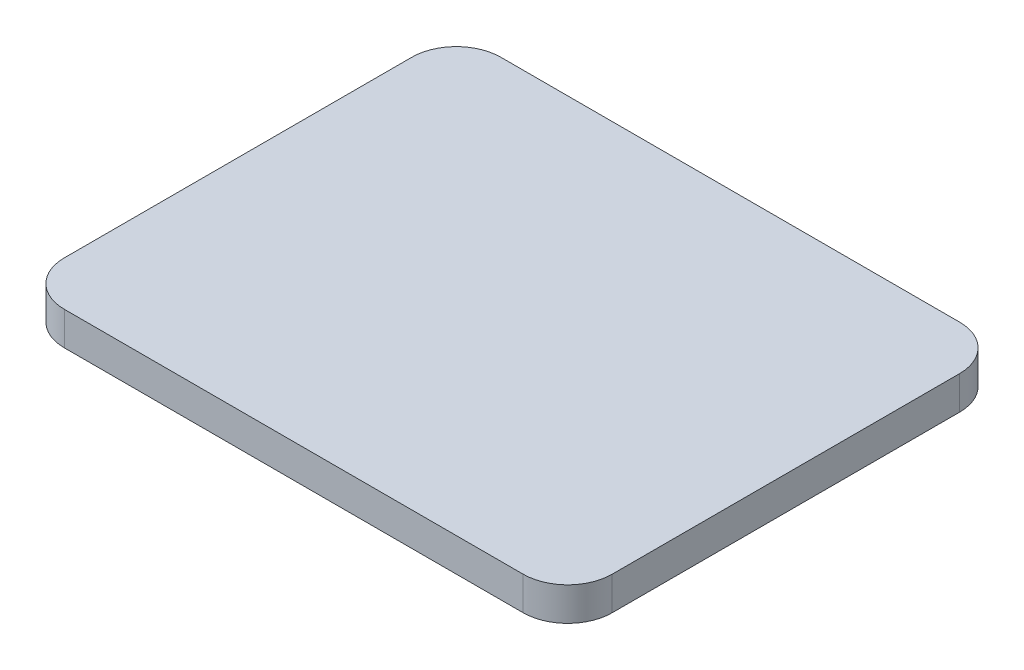
ISO-10303-21;
HEADER;
FILE_DESCRIPTION(('STEP AP214'),'2;1');
FILE_NAME('part.step','',(''),(''),'','','');
FILE_SCHEMA(('AUTOMOTIVE_DESIGN { 1 0 10303 214 1 1 1 1 }'));
ENDSEC;
DATA;
#1=APPLICATION_CONTEXT('core data for automotive mechanical design processes');
#2=APPLICATION_PROTOCOL_DEFINITION('international standard','automotive_design',2000,#1);
#3=PRODUCT_CONTEXT('',#1,'mechanical');
#4=PRODUCT('Part','Part','',(#3));
#5=PRODUCT_RELATED_PRODUCT_CATEGORY('part','',(#4));
#6=PRODUCT_DEFINITION_FORMATION('','',#4);
#7=PRODUCT_DEFINITION_CONTEXT('part definition',#1,'design');
#8=PRODUCT_DEFINITION('design','',#6,#7);
#9=PRODUCT_DEFINITION_SHAPE('','',#8);
#10=(LENGTH_UNIT() NAMED_UNIT(*) SI_UNIT(.MILLI.,.METRE.));
#11=(NAMED_UNIT(*) PLANE_ANGLE_UNIT() SI_UNIT($,.RADIAN.));
#12=(NAMED_UNIT(*) SI_UNIT($,.STERADIAN.) SOLID_ANGLE_UNIT());
#13=UNCERTAINTY_MEASURE_WITH_UNIT(LENGTH_MEASURE(1.E-05),#10,'distance_accuracy_value','');
#14=(GEOMETRIC_REPRESENTATION_CONTEXT(3) GLOBAL_UNCERTAINTY_ASSIGNED_CONTEXT((#13)) GLOBAL_UNIT_ASSIGNED_CONTEXT((#10,
#11,#12)) REPRESENTATION_CONTEXT('',''));
#15=CARTESIAN_POINT('',(0.,0.,0.));
#16=DIRECTION('',(0.,0.,1.));
#17=DIRECTION('',(1.,0.,0.));
#18=AXIS2_PLACEMENT_3D('',#15,#16,#17);
#19=CARTESIAN_POINT('',(0.,0.,0.));
#20=DIRECTION('',(0.,-1.,0.));
#21=DIRECTION('',(0.,0.,-1.));
#22=AXIS2_PLACEMENT_3D('',#19,#20,#21);
#23=PLANE('',#22);
#24=DIRECTION('',(1.,0.,0.));
#25=VECTOR('',#24,1.);
#26=CARTESIAN_POINT('',(0.,0.,0.));
#27=LINE('',#26,#25);
#28=CARTESIAN_POINT('',(5.08,0.,0.));
#29=VERTEX_POINT('',#28);
#30=CARTESIAN_POINT('',(57.404,0.,0.));
#31=VERTEX_POINT('',#30);
#32=EDGE_CURVE('E197',#29,#31,#27,.T.);
#33=ORIENTED_EDGE('',*,*,#32,.T.);
#34=CARTESIAN_POINT('',(57.404,0.,5.08));
#35=DIRECTION('',(0.,-1.,0.));
#36=DIRECTION('',(0.,0.,-1.));
#37=AXIS2_PLACEMENT_3D('',#34,#35,#36);
#38=CIRCLE('',#37,5.08);
#39=CARTESIAN_POINT('',(62.484,0.,5.08));
#40=VERTEX_POINT('',#39);
#41=EDGE_CURVE('E230',#31,#40,#38,.T.);
#42=ORIENTED_EDGE('',*,*,#41,.T.);
#43=DIRECTION('',(0.,0.,1.));
#44=VECTOR('',#43,1.);
#45=CARTESIAN_POINT('',(62.484,0.,0.));
#46=LINE('',#45,#44);
#47=CARTESIAN_POINT('',(62.484,0.,44.704));
#48=VERTEX_POINT('',#47);
#49=EDGE_CURVE('E214',#40,#48,#46,.T.);
#50=ORIENTED_EDGE('',*,*,#49,.T.);
#51=CARTESIAN_POINT('',(57.404,0.,44.704));
#52=DIRECTION('',(0.,-1.,0.));
#53=DIRECTION('',(0.,0.,-1.));
#54=AXIS2_PLACEMENT_3D('',#51,#52,#53);
#55=CIRCLE('',#54,5.08);
#56=CARTESIAN_POINT('',(57.404,0.,49.784));
#57=VERTEX_POINT('',#56);
#58=EDGE_CURVE('E228',#48,#57,#55,.T.);
#59=ORIENTED_EDGE('',*,*,#58,.T.);
#60=DIRECTION('',(1.,0.,0.));
#61=VECTOR('',#60,1.);
#62=CARTESIAN_POINT('',(0.,0.,49.784));
#63=LINE('',#62,#61);
#64=CARTESIAN_POINT('',(5.08,0.,49.784));
#65=VERTEX_POINT('',#64);
#66=EDGE_CURVE('E365',#65,#57,#63,.T.);
#67=ORIENTED_EDGE('',*,*,#66,.F.);
#68=CARTESIAN_POINT('',(5.08,0.,44.704));
#69=DIRECTION('',(0.,-1.,0.));
#70=DIRECTION('',(0.,0.,-1.));
#71=AXIS2_PLACEMENT_3D('',#68,#69,#70);
#72=CIRCLE('',#71,5.08);
#73=CARTESIAN_POINT('',(0.,0.,44.704));
#74=VERTEX_POINT('',#73);
#75=EDGE_CURVE('E204',#65,#74,#72,.T.);
#76=ORIENTED_EDGE('',*,*,#75,.T.);
#77=DIRECTION('',(0.,0.,1.));
#78=VECTOR('',#77,1.);
#79=CARTESIAN_POINT('',(0.,0.,0.));
#80=LINE('',#79,#78);
#81=CARTESIAN_POINT('',(0.,0.,5.08));
#82=VERTEX_POINT('',#81);
#83=EDGE_CURVE('E199',#82,#74,#80,.T.);
#84=ORIENTED_EDGE('',*,*,#83,.F.);
#85=CARTESIAN_POINT('',(5.08,0.,5.08));
#86=DIRECTION('',(0.,-1.,0.));
#87=DIRECTION('',(0.,0.,-1.));
#88=AXIS2_PLACEMENT_3D('',#85,#86,#87);
#89=CIRCLE('',#88,5.08);
#90=EDGE_CURVE('E194',#82,#29,#89,.T.);
#91=ORIENTED_EDGE('',*,*,#90,.T.);
#92=EDGE_LOOP('',(#33,#42,#50,#59,#67,#76,#84,#91));
#93=FACE_BOUND('',#92,.T.);
#94=DIRECTION('',(-1.,0.,0.));
#95=VECTOR('',#94,1.);
#96=CARTESIAN_POINT('',(58.547,0.,45.847));
#97=LINE('',#96,#95);
#98=CARTESIAN_POINT('',(53.467,0.,45.847));
#99=VERTEX_POINT('',#98);
#100=CARTESIAN_POINT('',(9.01700000000002,0.,45.847));
#101=VERTEX_POINT('',#100);
#102=EDGE_CURVE('E369',#99,#101,#97,.T.);
#103=ORIENTED_EDGE('',*,*,#102,.F.);
#104=CARTESIAN_POINT('',(53.467,0.,40.767));
#105=DIRECTION('',(0.,-1.,0.));
#106=DIRECTION('',(0.,0.,-1.));
#107=AXIS2_PLACEMENT_3D('',#104,#105,#106);
#108=CIRCLE('',#107,5.08);
#109=CARTESIAN_POINT('',(58.547,0.,40.767));
#110=VERTEX_POINT('',#109);
#111=EDGE_CURVE('E287',#99,#110,#108,.F.);
#112=ORIENTED_EDGE('',*,*,#111,.T.);
#113=DIRECTION('',(0.,0.,1.));
#114=VECTOR('',#113,1.);
#115=CARTESIAN_POINT('',(58.547,0.,3.937));
#116=LINE('',#115,#114);
#117=CARTESIAN_POINT('',(58.547,0.,9.017));
#118=VERTEX_POINT('',#117);
#119=EDGE_CURVE('E366',#118,#110,#116,.T.);
#120=ORIENTED_EDGE('',*,*,#119,.F.);
#121=CARTESIAN_POINT('',(53.467,0.,9.017));
#122=DIRECTION('',(0.,-1.,0.));
#123=DIRECTION('',(0.,0.,-1.));
#124=AXIS2_PLACEMENT_3D('',#121,#122,#123);
#125=CIRCLE('',#124,5.08);
#126=CARTESIAN_POINT('',(53.467,0.,3.937));
#127=VERTEX_POINT('',#126);
#128=EDGE_CURVE('E285',#118,#127,#125,.F.);
#129=ORIENTED_EDGE('',*,*,#128,.T.);
#130=DIRECTION('',(1.,0.,0.));
#131=VECTOR('',#130,1.);
#132=CARTESIAN_POINT('',(3.937,0.,3.937));
#133=LINE('',#132,#131);
#134=CARTESIAN_POINT('',(9.017,0.,3.937));
#135=VERTEX_POINT('',#134);
#136=EDGE_CURVE('E356',#135,#127,#133,.T.);
#137=ORIENTED_EDGE('',*,*,#136,.F.);
#138=CARTESIAN_POINT('',(9.017,0.,9.017));
#139=DIRECTION('',(0.,-1.,0.));
#140=DIRECTION('',(0.,0.,-1.));
#141=AXIS2_PLACEMENT_3D('',#138,#139,#140);
#142=CIRCLE('',#141,5.08);
#143=CARTESIAN_POINT('',(3.937,0.,9.017));
#144=VERTEX_POINT('',#143);
#145=EDGE_CURVE('E283',#135,#144,#142,.F.);
#146=ORIENTED_EDGE('',*,*,#145,.T.);
#147=DIRECTION('',(0.,0.,-1.));
#148=VECTOR('',#147,1.);
#149=CARTESIAN_POINT('',(3.937,0.,45.847));
#150=LINE('',#149,#148);
#151=CARTESIAN_POINT('',(3.937,0.,40.767));
#152=VERTEX_POINT('',#151);
#153=EDGE_CURVE('E373',#152,#144,#150,.T.);
#154=ORIENTED_EDGE('',*,*,#153,.F.);
#155=CARTESIAN_POINT('',(9.017,0.,40.767));
#156=DIRECTION('',(0.,-1.,0.));
#157=DIRECTION('',(0.,0.,-1.));
#158=AXIS2_PLACEMENT_3D('',#155,#156,#157);
#159=CIRCLE('',#158,5.08);
#160=EDGE_CURVE('E281',#152,#101,#159,.F.);
#161=ORIENTED_EDGE('',*,*,#160,.T.);
#162=EDGE_LOOP('',(#103,#112,#120,#129,#137,#146,#154,#161));
#163=FACE_BOUND('',#162,.T.);
#164=ADVANCED_FACE('F33',(#93,#163),#23,.T.);
#165=CARTESIAN_POINT('',(0.,3.81,49.784));
#166=DIRECTION('',(0.,0.,-1.));
#167=DIRECTION('',(-1.,0.,0.));
#168=AXIS2_PLACEMENT_3D('',#165,#166,#167);
#169=PLANE('',#168);
#170=ORIENTED_EDGE('',*,*,#66,.T.);
#171=DIRECTION('',(0.,-1.,0.));
#172=VECTOR('',#171,1.);
#173=CARTESIAN_POINT('',(57.404,3.81,49.784));
#174=LINE('',#173,#172);
#175=CARTESIAN_POINT('',(57.404,3.81,49.784));
#176=VERTEX_POINT('',#175);
#177=EDGE_CURVE('E247',#57,#176,#174,.F.);
#178=ORIENTED_EDGE('',*,*,#177,.T.);
#179=DIRECTION('',(1.,0.,0.));
#180=VECTOR('',#179,1.);
#181=CARTESIAN_POINT('',(0.,3.81,49.784));
#182=LINE('',#181,#180);
#183=CARTESIAN_POINT('',(5.08,3.81,49.784));
#184=VERTEX_POINT('',#183);
#185=EDGE_CURVE('E378',#184,#176,#182,.T.);
#186=ORIENTED_EDGE('',*,*,#185,.F.);
#187=DIRECTION('',(0.,-1.,0.));
#188=VECTOR('',#187,1.);
#189=CARTESIAN_POINT('',(5.08,3.81,49.784));
#190=LINE('',#189,#188);
#191=EDGE_CURVE('E244',#184,#65,#190,.T.);
#192=ORIENTED_EDGE('',*,*,#191,.T.);
#193=EDGE_LOOP('',(#170,#178,#186,#192));
#194=FACE_BOUND('',#193,.T.);
#195=ADVANCED_FACE('F406',(#194),#169,.F.);
#196=CARTESIAN_POINT('',(62.484,3.81,0.));
#197=DIRECTION('',(1.,0.,0.));
#198=DIRECTION('',(0.,0.,-1.));
#199=AXIS2_PLACEMENT_3D('',#196,#197,#198);
#200=PLANE('',#199);
#201=ORIENTED_EDGE('',*,*,#49,.F.);
#202=DIRECTION('',(0.,-1.,0.));
#203=VECTOR('',#202,1.);
#204=CARTESIAN_POINT('',(62.484,3.81,5.08));
#205=LINE('',#204,#203);
#206=CARTESIAN_POINT('',(62.484,3.81,5.08));
#207=VERTEX_POINT('',#206);
#208=EDGE_CURVE('E235',#40,#207,#205,.F.);
#209=ORIENTED_EDGE('',*,*,#208,.T.);
#210=DIRECTION('',(0.,0.,1.));
#211=VECTOR('',#210,1.);
#212=CARTESIAN_POINT('',(62.484,3.81,0.));
#213=LINE('',#212,#211);
#214=CARTESIAN_POINT('',(62.484,3.81,44.704));
#215=VERTEX_POINT('',#214);
#216=EDGE_CURVE('E381',#207,#215,#213,.T.);
#217=ORIENTED_EDGE('',*,*,#216,.T.);
#218=DIRECTION('',(0.,-1.,0.));
#219=VECTOR('',#218,1.);
#220=CARTESIAN_POINT('',(62.484,0.,44.704));
#221=LINE('',#220,#219);
#222=EDGE_CURVE('E232',#215,#48,#221,.T.);
#223=ORIENTED_EDGE('',*,*,#222,.T.);
#224=EDGE_LOOP('',(#201,#209,#217,#223));
#225=FACE_BOUND('',#224,.T.);
#226=ADVANCED_FACE('F392',(#225),#200,.T.);
#227=CARTESIAN_POINT('',(0.,3.81,0.));
#228=DIRECTION('',(0.,0.,-1.));
#229=DIRECTION('',(-1.,0.,0.));
#230=AXIS2_PLACEMENT_3D('',#227,#228,#229);
#231=PLANE('',#230);
#232=DIRECTION('',(1.,0.,0.));
#233=VECTOR('',#232,1.);
#234=CARTESIAN_POINT('',(0.,3.81,0.));
#235=LINE('',#234,#233);
#236=CARTESIAN_POINT('',(5.08,3.81,0.));
#237=VERTEX_POINT('',#236);
#238=CARTESIAN_POINT('',(57.404,3.81,0.));
#239=VERTEX_POINT('',#238);
#240=EDGE_CURVE('E223',#237,#239,#235,.T.);
#241=ORIENTED_EDGE('',*,*,#240,.T.);
#242=DIRECTION('',(0.,-1.,0.));
#243=VECTOR('',#242,1.);
#244=CARTESIAN_POINT('',(57.404,3.81,0.));
#245=LINE('',#244,#243);
#246=EDGE_CURVE('E205',#239,#31,#245,.T.);
#247=ORIENTED_EDGE('',*,*,#246,.T.);
#248=ORIENTED_EDGE('',*,*,#32,.F.);
#249=DIRECTION('',(0.,-1.,0.));
#250=VECTOR('',#249,1.);
#251=CARTESIAN_POINT('',(5.08,3.81,0.));
#252=LINE('',#251,#250);
#253=EDGE_CURVE('E211',#29,#237,#252,.F.);
#254=ORIENTED_EDGE('',*,*,#253,.T.);
#255=EDGE_LOOP('',(#241,#247,#248,#254));
#256=FACE_BOUND('',#255,.T.);
#257=ADVANCED_FACE('F210',(#256),#231,.T.);
#258=CARTESIAN_POINT('',(0.,3.81,0.));
#259=DIRECTION('',(1.,0.,0.));
#260=DIRECTION('',(0.,0.,-1.));
#261=AXIS2_PLACEMENT_3D('',#258,#259,#260);
#262=PLANE('',#261);
#263=ORIENTED_EDGE('',*,*,#83,.T.);
#264=DIRECTION('',(0.,-1.,0.));
#265=VECTOR('',#264,1.);
#266=CARTESIAN_POINT('',(0.,3.81,44.704));
#267=LINE('',#266,#265);
#268=CARTESIAN_POINT('',(0.,3.81,44.704));
#269=VERTEX_POINT('',#268);
#270=EDGE_CURVE('E251',#74,#269,#267,.F.);
#271=ORIENTED_EDGE('',*,*,#270,.T.);
#272=DIRECTION('',(0.,0.,1.));
#273=VECTOR('',#272,1.);
#274=CARTESIAN_POINT('',(0.,3.81,0.));
#275=LINE('',#274,#273);
#276=CARTESIAN_POINT('',(0.,3.81,5.08));
#277=VERTEX_POINT('',#276);
#278=EDGE_CURVE('E219',#277,#269,#275,.T.);
#279=ORIENTED_EDGE('',*,*,#278,.F.);
#280=DIRECTION('',(0.,-1.,0.));
#281=VECTOR('',#280,1.);
#282=CARTESIAN_POINT('',(0.,0.,5.08));
#283=LINE('',#282,#281);
#284=EDGE_CURVE('E249',#277,#82,#283,.T.);
#285=ORIENTED_EDGE('',*,*,#284,.T.);
#286=EDGE_LOOP('',(#263,#271,#279,#285));
#287=FACE_BOUND('',#286,.T.);
#288=ADVANCED_FACE('F414',(#287),#262,.F.);
#289=CARTESIAN_POINT('',(0.,3.81,0.));
#290=DIRECTION('',(0.,-1.,0.));
#291=DIRECTION('',(0.,0.,-1.));
#292=AXIS2_PLACEMENT_3D('',#289,#290,#291);
#293=PLANE('',#292);
#294=ORIENTED_EDGE('',*,*,#216,.F.);
#295=CARTESIAN_POINT('',(57.404,3.81,5.08));
#296=DIRECTION('',(0.,-1.,0.));
#297=DIRECTION('',(0.,0.,-1.));
#298=AXIS2_PLACEMENT_3D('',#295,#296,#297);
#299=CIRCLE('',#298,5.08);
#300=EDGE_CURVE('E242',#207,#239,#299,.F.);
#301=ORIENTED_EDGE('',*,*,#300,.T.);
#302=ORIENTED_EDGE('',*,*,#240,.F.);
#303=CARTESIAN_POINT('',(5.08,3.81,5.08));
#304=DIRECTION('',(0.,-1.,0.));
#305=DIRECTION('',(0.,0.,-1.));
#306=AXIS2_PLACEMENT_3D('',#303,#304,#305);
#307=CIRCLE('',#306,5.08);
#308=EDGE_CURVE('E218',#237,#277,#307,.F.);
#309=ORIENTED_EDGE('',*,*,#308,.T.);
#310=ORIENTED_EDGE('',*,*,#278,.T.);
#311=CARTESIAN_POINT('',(5.08,3.81,44.704));
#312=DIRECTION('',(0.,-1.,0.));
#313=DIRECTION('',(0.,0.,-1.));
#314=AXIS2_PLACEMENT_3D('',#311,#312,#313);
#315=CIRCLE('',#314,5.08);
#316=EDGE_CURVE('E238',#269,#184,#315,.F.);
#317=ORIENTED_EDGE('',*,*,#316,.T.);
#318=ORIENTED_EDGE('',*,*,#185,.T.);
#319=CARTESIAN_POINT('',(57.404,3.81,44.704));
#320=DIRECTION('',(0.,-1.,0.));
#321=DIRECTION('',(0.,0.,-1.));
#322=AXIS2_PLACEMENT_3D('',#319,#320,#321);
#323=CIRCLE('',#322,5.08);
#324=EDGE_CURVE('E240',#176,#215,#323,.F.);
#325=ORIENTED_EDGE('',*,*,#324,.T.);
#326=EDGE_LOOP('',(#294,#301,#302,#309,#310,#317,#318,#325));
#327=FACE_BOUND('',#326,.T.);
#328=ADVANCED_FACE('F399',(#327),#293,.F.);
#329=CARTESIAN_POINT('',(0.,-3.81,0.));
#330=DIRECTION('',(0.,-1.,0.));
#331=DIRECTION('',(0.,0.,-1.));
#332=AXIS2_PLACEMENT_3D('',#329,#330,#331);
#333=PLANE('',#332);
#334=DIRECTION('',(-1.,0.,0.));
#335=VECTOR('',#334,1.);
#336=CARTESIAN_POINT('',(58.547,-3.81,45.847));
#337=LINE('',#336,#335);
#338=CARTESIAN_POINT('',(53.467,-3.81,45.847));
#339=VERTEX_POINT('',#338);
#340=CARTESIAN_POINT('',(9.01700000000002,-3.81,45.847));
#341=VERTEX_POINT('',#340);
#342=EDGE_CURVE('E355',#339,#341,#337,.T.);
#343=ORIENTED_EDGE('',*,*,#342,.T.);
#344=CARTESIAN_POINT('',(9.017,-3.81,40.767));
#345=DIRECTION('',(0.,-1.,0.));
#346=DIRECTION('',(0.,0.,-1.));
#347=AXIS2_PLACEMENT_3D('',#344,#345,#346);
#348=CIRCLE('',#347,5.08);
#349=CARTESIAN_POINT('',(3.937,-3.81,40.767));
#350=VERTEX_POINT('',#349);
#351=EDGE_CURVE('E269',#341,#350,#348,.T.);
#352=ORIENTED_EDGE('',*,*,#351,.T.);
#353=DIRECTION('',(0.,0.,-1.));
#354=VECTOR('',#353,1.);
#355=CARTESIAN_POINT('',(3.937,-3.81,45.847));
#356=LINE('',#355,#354);
#357=CARTESIAN_POINT('',(3.937,-3.81,9.017));
#358=VERTEX_POINT('',#357);
#359=EDGE_CURVE('E359',#350,#358,#356,.T.);
#360=ORIENTED_EDGE('',*,*,#359,.T.);
#361=CARTESIAN_POINT('',(9.017,-3.81,9.017));
#362=DIRECTION('',(0.,-1.,0.));
#363=DIRECTION('',(0.,0.,-1.));
#364=AXIS2_PLACEMENT_3D('',#361,#362,#363);
#365=CIRCLE('',#364,5.08);
#366=CARTESIAN_POINT('',(9.017,-3.81,3.937));
#367=VERTEX_POINT('',#366);
#368=EDGE_CURVE('E267',#358,#367,#365,.T.);
#369=ORIENTED_EDGE('',*,*,#368,.T.);
#370=DIRECTION('',(1.,0.,0.));
#371=VECTOR('',#370,1.);
#372=CARTESIAN_POINT('',(3.937,-3.81,3.937));
#373=LINE('',#372,#371);
#374=CARTESIAN_POINT('',(53.467,-3.81,3.937));
#375=VERTEX_POINT('',#374);
#376=EDGE_CURVE('E362',#367,#375,#373,.T.);
#377=ORIENTED_EDGE('',*,*,#376,.T.);
#378=CARTESIAN_POINT('',(53.467,-3.81,9.017));
#379=DIRECTION('',(0.,-1.,0.));
#380=DIRECTION('',(0.,0.,-1.));
#381=AXIS2_PLACEMENT_3D('',#378,#379,#380);
#382=CIRCLE('',#381,5.08);
#383=CARTESIAN_POINT('',(58.547,-3.81,9.017));
#384=VERTEX_POINT('',#383);
#385=EDGE_CURVE('E265',#375,#384,#382,.T.);
#386=ORIENTED_EDGE('',*,*,#385,.T.);
#387=DIRECTION('',(0.,0.,1.));
#388=VECTOR('',#387,1.);
#389=CARTESIAN_POINT('',(58.547,-3.81,3.937));
#390=LINE('',#389,#388);
#391=CARTESIAN_POINT('',(58.547,-3.81,40.767));
#392=VERTEX_POINT('',#391);
#393=EDGE_CURVE('E352',#384,#392,#390,.T.);
#394=ORIENTED_EDGE('',*,*,#393,.T.);
#395=CARTESIAN_POINT('',(53.467,-3.81,40.767));
#396=DIRECTION('',(0.,-1.,0.));
#397=DIRECTION('',(0.,0.,-1.));
#398=AXIS2_PLACEMENT_3D('',#395,#396,#397);
#399=CIRCLE('',#398,5.08);
#400=EDGE_CURVE('E263',#392,#339,#399,.T.);
#401=ORIENTED_EDGE('',*,*,#400,.T.);
#402=EDGE_LOOP('',(#343,#352,#360,#369,#377,#386,#394,#401));
#403=FACE_BOUND('',#402,.T.);
#404=DIRECTION('',(-1.,0.,0.));
#405=VECTOR('',#404,1.);
#406=CARTESIAN_POINT('',(56.007,-3.81,43.307));
#407=LINE('',#406,#405);
#408=CARTESIAN_POINT('',(53.467,-3.81,43.307));
#409=VERTEX_POINT('',#408);
#410=CARTESIAN_POINT('',(9.017,-3.81,43.307));
#411=VERTEX_POINT('',#410);
#412=EDGE_CURVE('E325',#409,#411,#407,.T.);
#413=ORIENTED_EDGE('',*,*,#412,.F.);
#414=CARTESIAN_POINT('',(53.467,-3.81,40.767));
#415=DIRECTION('',(0.,-1.,0.));
#416=DIRECTION('',(0.,0.,-1.));
#417=AXIS2_PLACEMENT_3D('',#414,#415,#416);
#418=CIRCLE('',#417,2.54);
#419=CARTESIAN_POINT('',(56.007,-3.81,40.767));
#420=VERTEX_POINT('',#419);
#421=EDGE_CURVE('E41',#409,#420,#418,.F.);
#422=ORIENTED_EDGE('',*,*,#421,.T.);
#423=DIRECTION('',(0.,0.,1.));
#424=VECTOR('',#423,1.);
#425=CARTESIAN_POINT('',(56.007,-3.81,6.477));
#426=LINE('',#425,#424);
#427=CARTESIAN_POINT('',(56.007,-3.81,9.017));
#428=VERTEX_POINT('',#427);
#429=EDGE_CURVE('E323',#428,#420,#426,.T.);
#430=ORIENTED_EDGE('',*,*,#429,.F.);
#431=CARTESIAN_POINT('',(53.467,-3.81,9.017));
#432=DIRECTION('',(0.,-1.,0.));
#433=DIRECTION('',(0.,0.,-1.));
#434=AXIS2_PLACEMENT_3D('',#431,#432,#433);
#435=CIRCLE('',#434,2.54);
#436=CARTESIAN_POINT('',(53.467,-3.81,6.477));
#437=VERTEX_POINT('',#436);
#438=EDGE_CURVE('E318',#428,#437,#435,.F.);
#439=ORIENTED_EDGE('',*,*,#438,.T.);
#440=DIRECTION('',(1.,0.,0.));
#441=VECTOR('',#440,1.);
#442=CARTESIAN_POINT('',(6.47700000000001,-3.81,6.477));
#443=LINE('',#442,#441);
#444=CARTESIAN_POINT('',(9.01700000000001,-3.81,6.477));
#445=VERTEX_POINT('',#444);
#446=EDGE_CURVE('E370',#445,#437,#443,.T.);
#447=ORIENTED_EDGE('',*,*,#446,.F.);
#448=CARTESIAN_POINT('',(9.01700000000001,-3.81,9.01700000000001));
#449=DIRECTION('',(0.,-1.,0.));
#450=DIRECTION('',(0.,0.,-1.));
#451=AXIS2_PLACEMENT_3D('',#448,#449,#450);
#452=CIRCLE('',#451,2.54);
#453=CARTESIAN_POINT('',(6.47700000000001,-3.81,9.01700000000001));
#454=VERTEX_POINT('',#453);
#455=EDGE_CURVE('E316',#445,#454,#452,.F.);
#456=ORIENTED_EDGE('',*,*,#455,.T.);
#457=DIRECTION('',(0.,0.,-1.));
#458=VECTOR('',#457,1.);
#459=CARTESIAN_POINT('',(6.47700000000001,-3.81,43.307));
#460=LINE('',#459,#458);
#461=CARTESIAN_POINT('',(6.47700000000001,-3.81,40.767));
#462=VERTEX_POINT('',#461);
#463=EDGE_CURVE('E524',#462,#454,#460,.T.);
#464=ORIENTED_EDGE('',*,*,#463,.F.);
#465=CARTESIAN_POINT('',(9.017,-3.81,40.767));
#466=DIRECTION('',(0.,-1.,0.));
#467=DIRECTION('',(0.,0.,-1.));
#468=AXIS2_PLACEMENT_3D('',#465,#466,#467);
#469=CIRCLE('',#468,2.54);
#470=EDGE_CURVE('E11',#462,#411,#469,.F.);
#471=ORIENTED_EDGE('',*,*,#470,.T.);
#472=EDGE_LOOP('',(#413,#422,#430,#439,#447,#456,#464,#471));
#473=FACE_BOUND('',#472,.T.);
#474=ADVANCED_FACE('F322',(#403,#473),#333,.T.);
#475=CARTESIAN_POINT('',(58.547,-3.81,3.937));
#476=DIRECTION('',(-1.,0.,0.));
#477=DIRECTION('',(0.,0.,1.));
#478=AXIS2_PLACEMENT_3D('',#475,#476,#477);
#479=PLANE('',#478);
#480=ORIENTED_EDGE('',*,*,#393,.F.);
#481=DIRECTION('',(0.,1.,0.));
#482=VECTOR('',#481,1.);
#483=CARTESIAN_POINT('',(58.547,-3.81,9.017));
#484=LINE('',#483,#482);
#485=EDGE_CURVE('E278',#384,#118,#484,.T.);
#486=ORIENTED_EDGE('',*,*,#485,.T.);
#487=ORIENTED_EDGE('',*,*,#119,.T.);
#488=DIRECTION('',(0.,1.,0.));
#489=VECTOR('',#488,1.);
#490=CARTESIAN_POINT('',(58.547,-3.81,40.767));
#491=LINE('',#490,#489);
#492=EDGE_CURVE('E276',#110,#392,#491,.F.);
#493=ORIENTED_EDGE('',*,*,#492,.T.);
#494=EDGE_LOOP('',(#480,#486,#487,#493));
#495=FACE_BOUND('',#494,.T.);
#496=ADVANCED_FACE('F453',(#495),#479,.F.);
#497=CARTESIAN_POINT('',(58.547,-3.81,45.847));
#498=DIRECTION('',(0.,0.,-1.));
#499=DIRECTION('',(-1.,0.,0.));
#500=AXIS2_PLACEMENT_3D('',#497,#498,#499);
#501=PLANE('',#500);
#502=ORIENTED_EDGE('',*,*,#102,.T.);
#503=DIRECTION('',(0.,1.,0.));
#504=VECTOR('',#503,1.);
#505=CARTESIAN_POINT('',(9.017,-3.81,45.847));
#506=LINE('',#505,#504);
#507=EDGE_CURVE('E261',#101,#341,#506,.F.);
#508=ORIENTED_EDGE('',*,*,#507,.T.);
#509=ORIENTED_EDGE('',*,*,#342,.F.);
#510=DIRECTION('',(0.,1.,0.));
#511=VECTOR('',#510,1.);
#512=CARTESIAN_POINT('',(53.467,-3.81,45.847));
#513=LINE('',#512,#511);
#514=EDGE_CURVE('E258',#339,#99,#513,.T.);
#515=ORIENTED_EDGE('',*,*,#514,.T.);
#516=EDGE_LOOP('',(#502,#508,#509,#515));
#517=FACE_BOUND('',#516,.T.);
#518=ADVANCED_FACE('F461',(#517),#501,.F.);
#519=CARTESIAN_POINT('',(3.937,-3.81,45.847));
#520=DIRECTION('',(1.,0.,0.));
#521=DIRECTION('',(0.,0.,-1.));
#522=AXIS2_PLACEMENT_3D('',#519,#520,#521);
#523=PLANE('',#522);
#524=ORIENTED_EDGE('',*,*,#359,.F.);
#525=DIRECTION('',(0.,1.,0.));
#526=VECTOR('',#525,1.);
#527=CARTESIAN_POINT('',(3.937,-3.81,40.767));
#528=LINE('',#527,#526);
#529=EDGE_CURVE('E255',#350,#152,#528,.T.);
#530=ORIENTED_EDGE('',*,*,#529,.T.);
#531=ORIENTED_EDGE('',*,*,#153,.T.);
#532=DIRECTION('',(0.,1.,0.));
#533=VECTOR('',#532,1.);
#534=CARTESIAN_POINT('',(3.937,-3.81,9.017));
#535=LINE('',#534,#533);
#536=EDGE_CURVE('E253',#144,#358,#535,.F.);
#537=ORIENTED_EDGE('',*,*,#536,.T.);
#538=EDGE_LOOP('',(#524,#530,#531,#537));
#539=FACE_BOUND('',#538,.T.);
#540=ADVANCED_FACE('F457',(#539),#523,.F.);
#541=CARTESIAN_POINT('',(3.937,-3.81,3.937));
#542=DIRECTION('',(0.,0.,1.));
#543=DIRECTION('',(1.,0.,0.));
#544=AXIS2_PLACEMENT_3D('',#541,#542,#543);
#545=PLANE('',#544);
#546=ORIENTED_EDGE('',*,*,#376,.F.);
#547=DIRECTION('',(0.,1.,0.));
#548=VECTOR('',#547,1.);
#549=CARTESIAN_POINT('',(9.017,-3.81,3.937));
#550=LINE('',#549,#548);
#551=EDGE_CURVE('E273',#367,#135,#550,.T.);
#552=ORIENTED_EDGE('',*,*,#551,.T.);
#553=ORIENTED_EDGE('',*,*,#136,.T.);
#554=DIRECTION('',(0.,1.,0.));
#555=VECTOR('',#554,1.);
#556=CARTESIAN_POINT('',(53.467,-3.81,3.937));
#557=LINE('',#556,#555);
#558=EDGE_CURVE('E271',#127,#375,#557,.F.);
#559=ORIENTED_EDGE('',*,*,#558,.T.);
#560=EDGE_LOOP('',(#546,#552,#553,#559));
#561=FACE_BOUND('',#560,.T.);
#562=ADVANCED_FACE('F450',(#561),#545,.F.);
#563=CARTESIAN_POINT('',(56.007,-3.81,6.477));
#564=DIRECTION('',(-1.,0.,0.));
#565=DIRECTION('',(0.,0.,1.));
#566=AXIS2_PLACEMENT_3D('',#563,#564,#565);
#567=PLANE('',#566);
#568=DIRECTION('',(0.,0.,1.));
#569=VECTOR('',#568,1.);
#570=CARTESIAN_POINT('',(56.007,0.,6.477));
#571=LINE('',#570,#569);
#572=CARTESIAN_POINT('',(56.007,0.,9.017));
#573=VERTEX_POINT('',#572);
#574=CARTESIAN_POINT('',(56.007,0.,40.767));
#575=VERTEX_POINT('',#574);
#576=EDGE_CURVE('E341',#573,#575,#571,.T.);
#577=ORIENTED_EDGE('',*,*,#576,.F.);
#578=DIRECTION('',(0.,1.,0.));
#579=VECTOR('',#578,1.);
#580=CARTESIAN_POINT('',(56.007,-3.81,9.017));
#581=LINE('',#580,#579);
#582=EDGE_CURVE('E310',#573,#428,#581,.F.);
#583=ORIENTED_EDGE('',*,*,#582,.T.);
#584=ORIENTED_EDGE('',*,*,#429,.T.);
#585=DIRECTION('',(0.,1.,0.));
#586=VECTOR('',#585,1.);
#587=CARTESIAN_POINT('',(56.007,0.,40.767));
#588=LINE('',#587,#586);
#589=EDGE_CURVE('E307',#420,#575,#588,.T.);
#590=ORIENTED_EDGE('',*,*,#589,.T.);
#591=EDGE_LOOP('',(#577,#583,#584,#590));
#592=FACE_BOUND('',#591,.T.);
#593=ADVANCED_FACE('F330',(#592),#567,.T.);
#594=CARTESIAN_POINT('',(56.007,-3.81,43.307));
#595=DIRECTION('',(0.,0.,-1.));
#596=DIRECTION('',(-1.,0.,0.));
#597=AXIS2_PLACEMENT_3D('',#594,#595,#596);
#598=PLANE('',#597);
#599=DIRECTION('',(-1.,0.,0.));
#600=VECTOR('',#599,1.);
#601=CARTESIAN_POINT('',(56.007,0.,43.307));
#602=LINE('',#601,#600);
#603=CARTESIAN_POINT('',(53.467,0.,43.307));
#604=VERTEX_POINT('',#603);
#605=CARTESIAN_POINT('',(9.017,0.,43.307));
#606=VERTEX_POINT('',#605);
#607=EDGE_CURVE('E340',#604,#606,#602,.T.);
#608=ORIENTED_EDGE('',*,*,#607,.F.);
#609=DIRECTION('',(0.,1.,0.));
#610=VECTOR('',#609,1.);
#611=CARTESIAN_POINT('',(53.467,-3.81,43.307));
#612=LINE('',#611,#610);
#613=EDGE_CURVE('E53',#604,#409,#612,.F.);
#614=ORIENTED_EDGE('',*,*,#613,.T.);
#615=ORIENTED_EDGE('',*,*,#412,.T.);
#616=DIRECTION('',(0.,1.,0.));
#617=VECTOR('',#616,1.);
#618=CARTESIAN_POINT('',(9.017,0.,43.307));
#619=LINE('',#618,#617);
#620=EDGE_CURVE('E312',#411,#606,#619,.T.);
#621=ORIENTED_EDGE('',*,*,#620,.T.);
#622=EDGE_LOOP('',(#608,#614,#615,#621));
#623=FACE_BOUND('',#622,.T.);
#624=ADVANCED_FACE('F342',(#623),#598,.T.);
#625=CARTESIAN_POINT('',(6.47700000000001,-3.81,43.307));
#626=DIRECTION('',(1.,0.,0.));
#627=DIRECTION('',(0.,0.,-1.));
#628=AXIS2_PLACEMENT_3D('',#625,#626,#627);
#629=PLANE('',#628);
#630=ORIENTED_EDGE('',*,*,#463,.T.);
#631=DIRECTION('',(0.,1.,0.));
#632=VECTOR('',#631,1.);
#633=CARTESIAN_POINT('',(6.47700000000001,0.,9.01700000000001));
#634=LINE('',#633,#632);
#635=CARTESIAN_POINT('',(6.47700000000001,0.,9.01700000000001));
#636=VERTEX_POINT('',#635);
#637=EDGE_CURVE('E291',#454,#636,#634,.T.);
#638=ORIENTED_EDGE('',*,*,#637,.T.);
#639=DIRECTION('',(0.,0.,-1.));
#640=VECTOR('',#639,1.);
#641=CARTESIAN_POINT('',(6.47700000000001,0.,43.307));
#642=LINE('',#641,#640);
#643=CARTESIAN_POINT('',(6.47700000000001,0.,40.767));
#644=VERTEX_POINT('',#643);
#645=EDGE_CURVE('E344',#644,#636,#642,.T.);
#646=ORIENTED_EDGE('',*,*,#645,.F.);
#647=DIRECTION('',(0.,1.,0.));
#648=VECTOR('',#647,1.);
#649=CARTESIAN_POINT('',(6.47700000000001,-3.81,40.767));
#650=LINE('',#649,#648);
#651=EDGE_CURVE('E289',#644,#462,#650,.F.);
#652=ORIENTED_EDGE('',*,*,#651,.T.);
#653=EDGE_LOOP('',(#630,#638,#646,#652));
#654=FACE_BOUND('',#653,.T.);
#655=ADVANCED_FACE('F436',(#654),#629,.T.);
#656=CARTESIAN_POINT('',(6.47700000000001,-3.81,6.477));
#657=DIRECTION('',(0.,0.,1.));
#658=DIRECTION('',(1.,0.,0.));
#659=AXIS2_PLACEMENT_3D('',#656,#657,#658);
#660=PLANE('',#659);
#661=DIRECTION('',(1.,0.,0.));
#662=VECTOR('',#661,1.);
#663=CARTESIAN_POINT('',(6.47700000000001,0.,6.477));
#664=LINE('',#663,#662);
#665=CARTESIAN_POINT('',(9.01700000000001,0.,6.477));
#666=VERTEX_POINT('',#665);
#667=CARTESIAN_POINT('',(53.467,0.,6.477));
#668=VERTEX_POINT('',#667);
#669=EDGE_CURVE('E333',#666,#668,#664,.T.);
#670=ORIENTED_EDGE('',*,*,#669,.F.);
#671=DIRECTION('',(0.,1.,0.));
#672=VECTOR('',#671,1.);
#673=CARTESIAN_POINT('',(9.01700000000001,-3.81,6.477));
#674=LINE('',#673,#672);
#675=EDGE_CURVE('E305',#666,#445,#674,.F.);
#676=ORIENTED_EDGE('',*,*,#675,.T.);
#677=ORIENTED_EDGE('',*,*,#446,.T.);
#678=DIRECTION('',(0.,1.,0.));
#679=VECTOR('',#678,1.);
#680=CARTESIAN_POINT('',(53.467,0.,6.477));
#681=LINE('',#680,#679);
#682=EDGE_CURVE('E302',#437,#668,#681,.T.);
#683=ORIENTED_EDGE('',*,*,#682,.T.);
#684=EDGE_LOOP('',(#670,#676,#677,#683));
#685=FACE_BOUND('',#684,.T.);
#686=ADVANCED_FACE('F430',(#685),#660,.T.);
#687=ORIENTED_EDGE('',*,*,#645,.T.);
#688=CARTESIAN_POINT('',(9.01700000000001,0.,9.01700000000001));
#689=DIRECTION('',(0.,-1.,0.));
#690=DIRECTION('',(0.,0.,-1.));
#691=AXIS2_PLACEMENT_3D('',#688,#689,#690);
#692=CIRCLE('',#691,2.54);
#693=EDGE_CURVE('E300',#636,#666,#692,.T.);
#694=ORIENTED_EDGE('',*,*,#693,.T.);
#695=ORIENTED_EDGE('',*,*,#669,.T.);
#696=CARTESIAN_POINT('',(53.467,0.,9.017));
#697=DIRECTION('',(0.,-1.,0.));
#698=DIRECTION('',(0.,0.,-1.));
#699=AXIS2_PLACEMENT_3D('',#696,#697,#698);
#700=CIRCLE('',#699,2.54);
#701=EDGE_CURVE('E298',#668,#573,#700,.T.);
#702=ORIENTED_EDGE('',*,*,#701,.T.);
#703=ORIENTED_EDGE('',*,*,#576,.T.);
#704=CARTESIAN_POINT('',(53.467,0.,40.767));
#705=DIRECTION('',(0.,-1.,0.));
#706=DIRECTION('',(0.,0.,-1.));
#707=AXIS2_PLACEMENT_3D('',#704,#705,#706);
#708=CIRCLE('',#707,2.54);
#709=EDGE_CURVE('E296',#575,#604,#708,.T.);
#710=ORIENTED_EDGE('',*,*,#709,.T.);
#711=ORIENTED_EDGE('',*,*,#607,.T.);
#712=CARTESIAN_POINT('',(9.017,0.,40.767));
#713=DIRECTION('',(0.,-1.,0.));
#714=DIRECTION('',(0.,0.,-1.));
#715=AXIS2_PLACEMENT_3D('',#712,#713,#714);
#716=CIRCLE('',#715,2.54);
#717=EDGE_CURVE('E294',#606,#644,#716,.T.);
#718=ORIENTED_EDGE('',*,*,#717,.T.);
#719=EDGE_LOOP('',(#687,#694,#695,#702,#703,#710,#711,#718));
#720=FACE_BOUND('',#719,.T.);
#721=ADVANCED_FACE('F339',(#720),#23,.T.);
#722=CARTESIAN_POINT('',(57.404,3.81,5.08));
#723=DIRECTION('',(0.,-1.,0.));
#724=DIRECTION('',(0.,0.,-1.));
#725=AXIS2_PLACEMENT_3D('',#722,#723,#724);
#726=CYLINDRICAL_SURFACE('',#725,5.08);
#727=ORIENTED_EDGE('',*,*,#300,.F.);
#728=ORIENTED_EDGE('',*,*,#208,.F.);
#729=ORIENTED_EDGE('',*,*,#41,.F.);
#730=ORIENTED_EDGE('',*,*,#246,.F.);
#731=EDGE_LOOP('',(#727,#728,#729,#730));
#732=FACE_BOUND('',#731,.T.);
#733=ADVANCED_FACE('F397',(#732),#726,.T.);
#734=CARTESIAN_POINT('',(57.404,3.81,44.704));
#735=DIRECTION('',(0.,1.,0.));
#736=DIRECTION('',(0.,0.,1.));
#737=AXIS2_PLACEMENT_3D('',#734,#735,#736);
#738=CYLINDRICAL_SURFACE('',#737,5.08);
#739=ORIENTED_EDGE('',*,*,#324,.F.);
#740=ORIENTED_EDGE('',*,*,#177,.F.);
#741=ORIENTED_EDGE('',*,*,#58,.F.);
#742=ORIENTED_EDGE('',*,*,#222,.F.);
#743=EDGE_LOOP('',(#739,#740,#741,#742));
#744=FACE_BOUND('',#743,.T.);
#745=ADVANCED_FACE('F402',(#744),#738,.T.);
#746=CARTESIAN_POINT('',(5.08,3.81,44.704));
#747=DIRECTION('',(0.,-1.,0.));
#748=DIRECTION('',(0.,0.,-1.));
#749=AXIS2_PLACEMENT_3D('',#746,#747,#748);
#750=CYLINDRICAL_SURFACE('',#749,5.08);
#751=ORIENTED_EDGE('',*,*,#316,.F.);
#752=ORIENTED_EDGE('',*,*,#270,.F.);
#753=ORIENTED_EDGE('',*,*,#75,.F.);
#754=ORIENTED_EDGE('',*,*,#191,.F.);
#755=EDGE_LOOP('',(#751,#752,#753,#754));
#756=FACE_BOUND('',#755,.T.);
#757=ADVANCED_FACE('F412',(#756),#750,.T.);
#758=CARTESIAN_POINT('',(5.08,3.81,5.08));
#759=DIRECTION('',(0.,1.,0.));
#760=DIRECTION('',(0.,0.,1.));
#761=AXIS2_PLACEMENT_3D('',#758,#759,#760);
#762=CYLINDRICAL_SURFACE('',#761,5.08);
#763=ORIENTED_EDGE('',*,*,#308,.F.);
#764=ORIENTED_EDGE('',*,*,#253,.F.);
#765=ORIENTED_EDGE('',*,*,#90,.F.);
#766=ORIENTED_EDGE('',*,*,#284,.F.);
#767=EDGE_LOOP('',(#763,#764,#765,#766));
#768=FACE_BOUND('',#767,.T.);
#769=ADVANCED_FACE('F217',(#768),#762,.T.);
#770=CARTESIAN_POINT('',(9.017,-3.81,40.767));
#771=DIRECTION('',(0.,1.,0.));
#772=DIRECTION('',(0.,0.,1.));
#773=AXIS2_PLACEMENT_3D('',#770,#771,#772);
#774=CYLINDRICAL_SURFACE('',#773,5.08);
#775=ORIENTED_EDGE('',*,*,#351,.F.);
#776=ORIENTED_EDGE('',*,*,#507,.F.);
#777=ORIENTED_EDGE('',*,*,#160,.F.);
#778=ORIENTED_EDGE('',*,*,#529,.F.);
#779=EDGE_LOOP('',(#775,#776,#777,#778));
#780=FACE_BOUND('',#779,.T.);
#781=ADVANCED_FACE('F492',(#780),#774,.T.);
#782=CARTESIAN_POINT('',(9.017,-3.81,9.017));
#783=DIRECTION('',(0.,1.,0.));
#784=DIRECTION('',(0.,0.,1.));
#785=AXIS2_PLACEMENT_3D('',#782,#783,#784);
#786=CYLINDRICAL_SURFACE('',#785,5.08);
#787=ORIENTED_EDGE('',*,*,#368,.F.);
#788=ORIENTED_EDGE('',*,*,#536,.F.);
#789=ORIENTED_EDGE('',*,*,#145,.F.);
#790=ORIENTED_EDGE('',*,*,#551,.F.);
#791=EDGE_LOOP('',(#787,#788,#789,#790));
#792=FACE_BOUND('',#791,.T.);
#793=ADVANCED_FACE('F485',(#792),#786,.T.);
#794=CARTESIAN_POINT('',(53.467,-3.81,9.017));
#795=DIRECTION('',(0.,1.,0.));
#796=DIRECTION('',(0.,0.,1.));
#797=AXIS2_PLACEMENT_3D('',#794,#795,#796);
#798=CYLINDRICAL_SURFACE('',#797,5.08);
#799=ORIENTED_EDGE('',*,*,#385,.F.);
#800=ORIENTED_EDGE('',*,*,#558,.F.);
#801=ORIENTED_EDGE('',*,*,#128,.F.);
#802=ORIENTED_EDGE('',*,*,#485,.F.);
#803=EDGE_LOOP('',(#799,#800,#801,#802));
#804=FACE_BOUND('',#803,.T.);
#805=ADVANCED_FACE('F477',(#804),#798,.T.);
#806=CARTESIAN_POINT('',(53.467,-3.81,40.767));
#807=DIRECTION('',(0.,1.,0.));
#808=DIRECTION('',(0.,0.,1.));
#809=AXIS2_PLACEMENT_3D('',#806,#807,#808);
#810=CYLINDRICAL_SURFACE('',#809,5.08);
#811=ORIENTED_EDGE('',*,*,#400,.F.);
#812=ORIENTED_EDGE('',*,*,#492,.F.);
#813=ORIENTED_EDGE('',*,*,#111,.F.);
#814=ORIENTED_EDGE('',*,*,#514,.F.);
#815=EDGE_LOOP('',(#811,#812,#813,#814));
#816=FACE_BOUND('',#815,.T.);
#817=ADVANCED_FACE('F497',(#816),#810,.T.);
#818=CARTESIAN_POINT('',(9.01700000000001,-3.81,9.01700000000001));
#819=DIRECTION('',(0.,-1.,0.));
#820=DIRECTION('',(0.,0.,-1.));
#821=AXIS2_PLACEMENT_3D('',#818,#819,#820);
#822=CYLINDRICAL_SURFACE('',#821,2.54);
#823=ORIENTED_EDGE('',*,*,#455,.F.);
#824=ORIENTED_EDGE('',*,*,#675,.F.);
#825=ORIENTED_EDGE('',*,*,#693,.F.);
#826=ORIENTED_EDGE('',*,*,#637,.F.);
#827=EDGE_LOOP('',(#823,#824,#825,#826));
#828=FACE_BOUND('',#827,.T.);
#829=ADVANCED_FACE('F499',(#828),#822,.F.);
#830=CARTESIAN_POINT('',(53.467,-3.81,9.017));
#831=DIRECTION('',(0.,-1.,0.));
#832=DIRECTION('',(0.,0.,-1.));
#833=AXIS2_PLACEMENT_3D('',#830,#831,#832);
#834=CYLINDRICAL_SURFACE('',#833,2.54);
#835=ORIENTED_EDGE('',*,*,#438,.F.);
#836=ORIENTED_EDGE('',*,*,#582,.F.);
#837=ORIENTED_EDGE('',*,*,#701,.F.);
#838=ORIENTED_EDGE('',*,*,#682,.F.);
#839=EDGE_LOOP('',(#835,#836,#837,#838));
#840=FACE_BOUND('',#839,.T.);
#841=ADVANCED_FACE('F505',(#840),#834,.F.);
#842=CARTESIAN_POINT('',(53.467,-3.81,40.767));
#843=DIRECTION('',(0.,-1.,0.));
#844=DIRECTION('',(0.,0.,-1.));
#845=AXIS2_PLACEMENT_3D('',#842,#843,#844);
#846=CYLINDRICAL_SURFACE('',#845,2.54);
#847=ORIENTED_EDGE('',*,*,#421,.F.);
#848=ORIENTED_EDGE('',*,*,#613,.F.);
#849=ORIENTED_EDGE('',*,*,#709,.F.);
#850=ORIENTED_EDGE('',*,*,#589,.F.);
#851=EDGE_LOOP('',(#847,#848,#849,#850));
#852=FACE_BOUND('',#851,.T.);
#853=ADVANCED_FACE('F335',(#852),#846,.F.);
#854=CARTESIAN_POINT('',(9.017,-3.81,40.767));
#855=DIRECTION('',(0.,-1.,0.));
#856=DIRECTION('',(0.,0.,-1.));
#857=AXIS2_PLACEMENT_3D('',#854,#855,#856);
#858=CYLINDRICAL_SURFACE('',#857,2.54);
#859=ORIENTED_EDGE('',*,*,#470,.F.);
#860=ORIENTED_EDGE('',*,*,#651,.F.);
#861=ORIENTED_EDGE('',*,*,#717,.F.);
#862=ORIENTED_EDGE('',*,*,#620,.F.);
#863=EDGE_LOOP('',(#859,#860,#861,#862));
#864=FACE_BOUND('',#863,.T.);
#865=ADVANCED_FACE('F35',(#864),#858,.F.);
#866=CLOSED_SHELL('',(#164,#195,#226,#257,#288,#328,#474,#496,#518,#540,#562,#593,#624,#655,
#686,#721,#733,#745,#757,#769,#781,#793,#805,#817,#829,#841,#853,#865));
#867=MANIFOLD_SOLID_BREP('B2',#866);
#868=ADVANCED_BREP_SHAPE_REPRESENTATION('',(#18,#867),#14);
#869=SHAPE_DEFINITION_REPRESENTATION(#9,#868);
ENDSEC;
END-ISO-10303-21;
